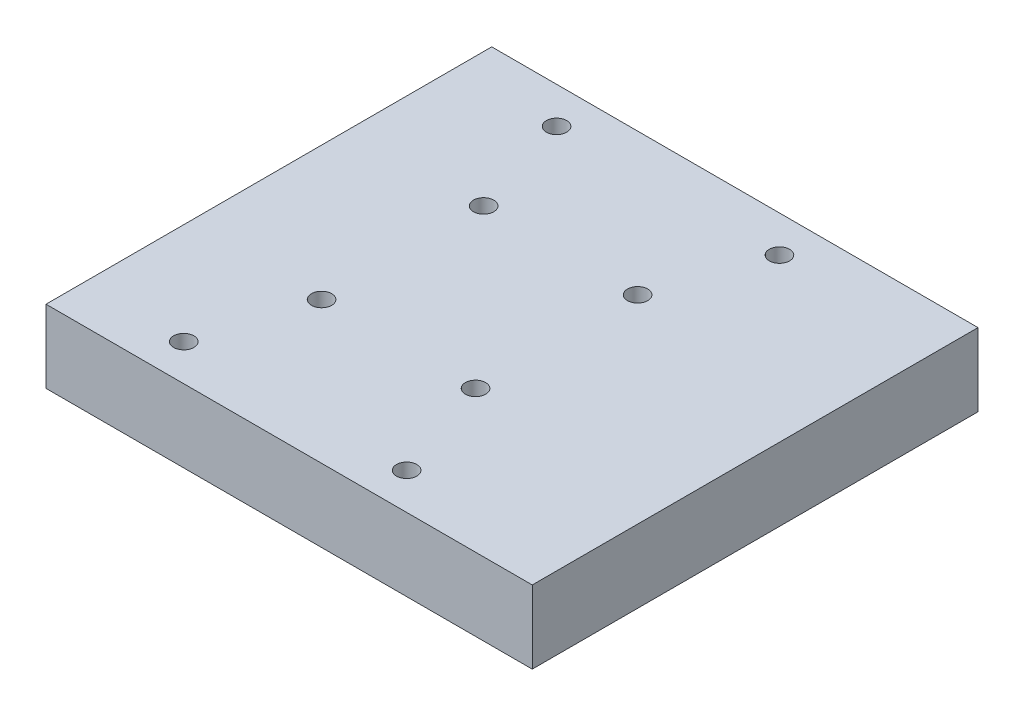
ISO-10303-21;
HEADER;
FILE_DESCRIPTION(('STEP AP214'),'2;1');
FILE_NAME('part.step','',(''),(''),'','','');
FILE_SCHEMA(('AUTOMOTIVE_DESIGN { 1 0 10303 214 1 1 1 1 }'));
ENDSEC;
DATA;
#1=APPLICATION_CONTEXT('core data for automotive mechanical design processes');
#2=APPLICATION_PROTOCOL_DEFINITION('international standard','automotive_design',2000,#1);
#3=PRODUCT_CONTEXT('',#1,'mechanical');
#4=PRODUCT('Part','Part','',(#3));
#5=PRODUCT_RELATED_PRODUCT_CATEGORY('part','',(#4));
#6=PRODUCT_DEFINITION_FORMATION('','',#4);
#7=PRODUCT_DEFINITION_CONTEXT('part definition',#1,'design');
#8=PRODUCT_DEFINITION('design','',#6,#7);
#9=PRODUCT_DEFINITION_SHAPE('','',#8);
#10=(LENGTH_UNIT() NAMED_UNIT(*) SI_UNIT(.MILLI.,.METRE.));
#11=(NAMED_UNIT(*) PLANE_ANGLE_UNIT() SI_UNIT($,.RADIAN.));
#12=(NAMED_UNIT(*) SI_UNIT($,.STERADIAN.) SOLID_ANGLE_UNIT());
#13=UNCERTAINTY_MEASURE_WITH_UNIT(LENGTH_MEASURE(1.E-05),#10,'distance_accuracy_value','');
#14=(GEOMETRIC_REPRESENTATION_CONTEXT(3) GLOBAL_UNCERTAINTY_ASSIGNED_CONTEXT((#13)) GLOBAL_UNIT_ASSIGNED_CONTEXT((#10,
#11,#12)) REPRESENTATION_CONTEXT('',''));
#15=CARTESIAN_POINT('',(0.,0.,0.));
#16=DIRECTION('',(0.,0.,1.));
#17=DIRECTION('',(1.,0.,0.));
#18=AXIS2_PLACEMENT_3D('',#15,#16,#17);
#19=CARTESIAN_POINT('',(60.,18.,-55.));
#20=DIRECTION('',(-1.,0.,0.));
#21=DIRECTION('',(0.,0.,1.));
#22=AXIS2_PLACEMENT_3D('',#19,#20,#21);
#23=PLANE('',#22);
#24=DIRECTION('',(0.,0.,-1.));
#25=VECTOR('',#24,1.);
#26=CARTESIAN_POINT('',(60.,0.,-55.));
#27=LINE('',#26,#25);
#28=CARTESIAN_POINT('',(60.,0.,55.));
#29=VERTEX_POINT('',#28);
#30=CARTESIAN_POINT('',(60.,0.,-55.));
#31=VERTEX_POINT('',#30);
#32=EDGE_CURVE('E96',#29,#31,#27,.T.);
#33=ORIENTED_EDGE('',*,*,#32,.T.);
#34=DIRECTION('',(0.,-1.,0.));
#35=VECTOR('',#34,1.);
#36=CARTESIAN_POINT('',(60.,18.,-55.));
#37=LINE('',#36,#35);
#38=CARTESIAN_POINT('',(60.,18.,-55.));
#39=VERTEX_POINT('',#38);
#40=EDGE_CURVE('E11',#39,#31,#37,.T.);
#41=ORIENTED_EDGE('',*,*,#40,.F.);
#42=DIRECTION('',(0.,0.,-1.));
#43=VECTOR('',#42,1.);
#44=CARTESIAN_POINT('',(60.,18.,-55.));
#45=LINE('',#44,#43);
#46=CARTESIAN_POINT('',(60.,18.,55.));
#47=VERTEX_POINT('',#46);
#48=EDGE_CURVE('E84',#47,#39,#45,.T.);
#49=ORIENTED_EDGE('',*,*,#48,.F.);
#50=DIRECTION('',(0.,-1.,0.));
#51=VECTOR('',#50,1.);
#52=CARTESIAN_POINT('',(60.,18.,55.));
#53=LINE('',#52,#51);
#54=EDGE_CURVE('E92',#47,#29,#53,.T.);
#55=ORIENTED_EDGE('',*,*,#54,.T.);
#56=EDGE_LOOP('',(#33,#41,#49,#55));
#57=FACE_BOUND('',#56,.T.);
#58=ADVANCED_FACE('F33',(#57),#23,.F.);
#59=CARTESIAN_POINT('',(-60.,18.,-55.));
#60=DIRECTION('',(0.,0.,1.));
#61=DIRECTION('',(1.,0.,0.));
#62=AXIS2_PLACEMENT_3D('',#59,#60,#61);
#63=PLANE('',#62);
#64=DIRECTION('',(-1.,0.,0.));
#65=VECTOR('',#64,1.);
#66=CARTESIAN_POINT('',(-60.,0.,-55.));
#67=LINE('',#66,#65);
#68=CARTESIAN_POINT('',(-60.,0.,-55.));
#69=VERTEX_POINT('',#68);
#70=EDGE_CURVE('E88',#31,#69,#67,.T.);
#71=ORIENTED_EDGE('',*,*,#70,.T.);
#72=DIRECTION('',(0.,-1.,0.));
#73=VECTOR('',#72,1.);
#74=CARTESIAN_POINT('',(-60.,18.,-55.));
#75=LINE('',#74,#73);
#76=CARTESIAN_POINT('',(-60.,18.,-55.));
#77=VERTEX_POINT('',#76);
#78=EDGE_CURVE('E41',#77,#69,#75,.T.);
#79=ORIENTED_EDGE('',*,*,#78,.F.);
#80=DIRECTION('',(-1.,0.,0.));
#81=VECTOR('',#80,1.);
#82=CARTESIAN_POINT('',(-60.,18.,-55.));
#83=LINE('',#82,#81);
#84=EDGE_CURVE('E79',#39,#77,#83,.T.);
#85=ORIENTED_EDGE('',*,*,#84,.F.);
#86=ORIENTED_EDGE('',*,*,#40,.T.);
#87=EDGE_LOOP('',(#71,#79,#85,#86));
#88=FACE_BOUND('',#87,.T.);
#89=ADVANCED_FACE('F87',(#88),#63,.F.);
#90=CARTESIAN_POINT('',(-60.,18.,-55.));
#91=DIRECTION('',(1.,0.,0.));
#92=DIRECTION('',(0.,0.,-1.));
#93=AXIS2_PLACEMENT_3D('',#90,#91,#92);
#94=PLANE('',#93);
#95=DIRECTION('',(0.,0.,1.));
#96=VECTOR('',#95,1.);
#97=CARTESIAN_POINT('',(-60.,0.,-55.));
#98=LINE('',#97,#96);
#99=CARTESIAN_POINT('',(-60.,0.,55.));
#100=VERTEX_POINT('',#99);
#101=EDGE_CURVE('E66',#69,#100,#98,.T.);
#102=ORIENTED_EDGE('',*,*,#101,.T.);
#103=DIRECTION('',(0.,-1.,0.));
#104=VECTOR('',#103,1.);
#105=CARTESIAN_POINT('',(-60.,18.,55.));
#106=LINE('',#105,#104);
#107=CARTESIAN_POINT('',(-60.,18.,55.));
#108=VERTEX_POINT('',#107);
#109=EDGE_CURVE('E89',#108,#100,#106,.T.);
#110=ORIENTED_EDGE('',*,*,#109,.F.);
#111=DIRECTION('',(0.,0.,1.));
#112=VECTOR('',#111,1.);
#113=CARTESIAN_POINT('',(-60.,18.,-55.));
#114=LINE('',#113,#112);
#115=EDGE_CURVE('E82',#77,#108,#114,.T.);
#116=ORIENTED_EDGE('',*,*,#115,.F.);
#117=ORIENTED_EDGE('',*,*,#78,.T.);
#118=EDGE_LOOP('',(#102,#110,#116,#117));
#119=FACE_BOUND('',#118,.T.);
#120=ADVANCED_FACE('F90',(#119),#94,.F.);
#121=CARTESIAN_POINT('',(-60.,18.,55.));
#122=DIRECTION('',(0.,0.,-1.));
#123=DIRECTION('',(-1.,0.,0.));
#124=AXIS2_PLACEMENT_3D('',#121,#122,#123);
#125=PLANE('',#124);
#126=DIRECTION('',(1.,0.,0.));
#127=VECTOR('',#126,1.);
#128=CARTESIAN_POINT('',(-60.,0.,55.));
#129=LINE('',#128,#127);
#130=EDGE_CURVE('E72',#100,#29,#129,.T.);
#131=ORIENTED_EDGE('',*,*,#130,.T.);
#132=ORIENTED_EDGE('',*,*,#54,.F.);
#133=DIRECTION('',(1.,0.,0.));
#134=VECTOR('',#133,1.);
#135=CARTESIAN_POINT('',(-60.,18.,55.));
#136=LINE('',#135,#134);
#137=EDGE_CURVE('E49',#108,#47,#136,.T.);
#138=ORIENTED_EDGE('',*,*,#137,.F.);
#139=ORIENTED_EDGE('',*,*,#109,.T.);
#140=EDGE_LOOP('',(#131,#132,#138,#139));
#141=FACE_BOUND('',#140,.T.);
#142=ADVANCED_FACE('F104',(#141),#125,.F.);
#143=CARTESIAN_POINT('',(0.,18.,0.));
#144=DIRECTION('',(0.,1.,0.));
#145=DIRECTION('',(0.,0.,1.));
#146=AXIS2_PLACEMENT_3D('',#143,#144,#145);
#147=PLANE('',#146);
#148=CARTESIAN_POINT('',(-27.,18.,-20.));
#149=DIRECTION('',(0.,-1.,0.));
#150=DIRECTION('',(0.,0.,-1.));
#151=AXIS2_PLACEMENT_3D('',#148,#149,#150);
#152=CIRCLE('',#151,2.5);
#153=CARTESIAN_POINT('',(-27.,18.,-22.5));
#154=VERTEX_POINT('',#153);
#155=EDGE_CURVE('E151',#154,#154,#152,.T.);
#156=ORIENTED_EDGE('',*,*,#155,.T.);
#157=EDGE_LOOP('',(#156));
#158=FACE_BOUND('',#157,.T.);
#159=CARTESIAN_POINT('',(11.,18.,-20.));
#160=DIRECTION('',(0.,-1.,0.));
#161=DIRECTION('',(0.,0.,-1.));
#162=AXIS2_PLACEMENT_3D('',#159,#160,#161);
#163=CIRCLE('',#162,2.5);
#164=CARTESIAN_POINT('',(11.,18.,-22.5));
#165=VERTEX_POINT('',#164);
#166=EDGE_CURVE('E145',#165,#165,#163,.T.);
#167=ORIENTED_EDGE('',*,*,#166,.T.);
#168=EDGE_LOOP('',(#167));
#169=FACE_BOUND('',#168,.T.);
#170=CARTESIAN_POINT('',(11.,18.,20.));
#171=DIRECTION('',(0.,-1.,0.));
#172=DIRECTION('',(0.,0.,-1.));
#173=AXIS2_PLACEMENT_3D('',#170,#171,#172);
#174=CIRCLE('',#173,2.5);
#175=CARTESIAN_POINT('',(11.,18.,17.5));
#176=VERTEX_POINT('',#175);
#177=EDGE_CURVE('E139',#176,#176,#174,.T.);
#178=ORIENTED_EDGE('',*,*,#177,.T.);
#179=EDGE_LOOP('',(#178));
#180=FACE_BOUND('',#179,.T.);
#181=CARTESIAN_POINT('',(-27.,18.,20.));
#182=DIRECTION('',(0.,-1.,0.));
#183=DIRECTION('',(0.,0.,-1.));
#184=AXIS2_PLACEMENT_3D('',#181,#182,#183);
#185=CIRCLE('',#184,2.5);
#186=CARTESIAN_POINT('',(-27.,18.,17.5));
#187=VERTEX_POINT('',#186);
#188=EDGE_CURVE('E133',#187,#187,#185,.T.);
#189=ORIENTED_EDGE('',*,*,#188,.T.);
#190=EDGE_LOOP('',(#189));
#191=FACE_BOUND('',#190,.T.);
#192=CARTESIAN_POINT('',(20.,18.,-46.));
#193=DIRECTION('',(0.,-1.,0.));
#194=DIRECTION('',(0.,0.,-1.));
#195=AXIS2_PLACEMENT_3D('',#192,#193,#194);
#196=CIRCLE('',#195,2.5);
#197=CARTESIAN_POINT('',(20.,18.,-48.5));
#198=VERTEX_POINT('',#197);
#199=EDGE_CURVE('E127',#198,#198,#196,.T.);
#200=ORIENTED_EDGE('',*,*,#199,.T.);
#201=EDGE_LOOP('',(#200));
#202=FACE_BOUND('',#201,.T.);
#203=CARTESIAN_POINT('',(-35.,18.,-46.));
#204=DIRECTION('',(0.,-1.,0.));
#205=DIRECTION('',(0.,0.,-1.));
#206=AXIS2_PLACEMENT_3D('',#203,#204,#205);
#207=CIRCLE('',#206,2.5);
#208=CARTESIAN_POINT('',(-35.,18.,-48.5));
#209=VERTEX_POINT('',#208);
#210=EDGE_CURVE('E121',#209,#209,#207,.T.);
#211=ORIENTED_EDGE('',*,*,#210,.T.);
#212=EDGE_LOOP('',(#211));
#213=FACE_BOUND('',#212,.T.);
#214=CARTESIAN_POINT('',(-35.,18.,46.));
#215=DIRECTION('',(0.,-1.,0.));
#216=DIRECTION('',(0.,0.,-1.));
#217=AXIS2_PLACEMENT_3D('',#214,#215,#216);
#218=CIRCLE('',#217,2.5);
#219=CARTESIAN_POINT('',(-35.,18.,43.5));
#220=VERTEX_POINT('',#219);
#221=EDGE_CURVE('E115',#220,#220,#218,.T.);
#222=ORIENTED_EDGE('',*,*,#221,.T.);
#223=EDGE_LOOP('',(#222));
#224=FACE_BOUND('',#223,.T.);
#225=CARTESIAN_POINT('',(20.,18.,46.));
#226=DIRECTION('',(0.,-1.,0.));
#227=DIRECTION('',(0.,0.,-1.));
#228=AXIS2_PLACEMENT_3D('',#225,#226,#227);
#229=CIRCLE('',#228,2.5);
#230=CARTESIAN_POINT('',(20.,18.,43.5));
#231=VERTEX_POINT('',#230);
#232=EDGE_CURVE('E99',#231,#231,#229,.T.);
#233=ORIENTED_EDGE('',*,*,#232,.T.);
#234=EDGE_LOOP('',(#233));
#235=FACE_BOUND('',#234,.T.);
#236=ORIENTED_EDGE('',*,*,#48,.T.);
#237=ORIENTED_EDGE('',*,*,#84,.T.);
#238=ORIENTED_EDGE('',*,*,#115,.T.);
#239=ORIENTED_EDGE('',*,*,#137,.T.);
#240=EDGE_LOOP('',(#236,#237,#238,#239));
#241=FACE_BOUND('',#240,.T.);
#242=ADVANCED_FACE('F80',(#158,#169,#180,#191,#202,#213,#224,#235,#241),#147,.T.);
#243=CARTESIAN_POINT('',(0.,0.,0.));
#244=DIRECTION('',(0.,1.,0.));
#245=DIRECTION('',(0.,0.,1.));
#246=AXIS2_PLACEMENT_3D('',#243,#244,#245);
#247=PLANE('',#246);
#248=CARTESIAN_POINT('',(-27.,0.,-20.));
#249=DIRECTION('',(0.,-1.,0.));
#250=DIRECTION('',(0.,0.,-1.));
#251=AXIS2_PLACEMENT_3D('',#248,#249,#250);
#252=CIRCLE('',#251,2.49999999999999);
#253=CARTESIAN_POINT('',(-27.,0.,-22.5));
#254=VERTEX_POINT('',#253);
#255=EDGE_CURVE('E154',#254,#254,#252,.T.);
#256=ORIENTED_EDGE('',*,*,#255,.F.);
#257=EDGE_LOOP('',(#256));
#258=FACE_BOUND('',#257,.T.);
#259=CARTESIAN_POINT('',(11.,0.,-20.));
#260=DIRECTION('',(0.,-1.,0.));
#261=DIRECTION('',(0.,0.,-1.));
#262=AXIS2_PLACEMENT_3D('',#259,#260,#261);
#263=CIRCLE('',#262,2.49999999999999);
#264=CARTESIAN_POINT('',(11.,0.,-22.5));
#265=VERTEX_POINT('',#264);
#266=EDGE_CURVE('E148',#265,#265,#263,.T.);
#267=ORIENTED_EDGE('',*,*,#266,.F.);
#268=EDGE_LOOP('',(#267));
#269=FACE_BOUND('',#268,.T.);
#270=CARTESIAN_POINT('',(11.,0.,20.));
#271=DIRECTION('',(0.,-1.,0.));
#272=DIRECTION('',(0.,0.,-1.));
#273=AXIS2_PLACEMENT_3D('',#270,#271,#272);
#274=CIRCLE('',#273,2.49999999999999);
#275=CARTESIAN_POINT('',(11.,0.,17.5));
#276=VERTEX_POINT('',#275);
#277=EDGE_CURVE('E142',#276,#276,#274,.T.);
#278=ORIENTED_EDGE('',*,*,#277,.F.);
#279=EDGE_LOOP('',(#278));
#280=FACE_BOUND('',#279,.T.);
#281=CARTESIAN_POINT('',(-27.,0.,20.));
#282=DIRECTION('',(0.,-1.,0.));
#283=DIRECTION('',(0.,0.,-1.));
#284=AXIS2_PLACEMENT_3D('',#281,#282,#283);
#285=CIRCLE('',#284,2.49999999999999);
#286=CARTESIAN_POINT('',(-27.,0.,17.5));
#287=VERTEX_POINT('',#286);
#288=EDGE_CURVE('E136',#287,#287,#285,.T.);
#289=ORIENTED_EDGE('',*,*,#288,.F.);
#290=EDGE_LOOP('',(#289));
#291=FACE_BOUND('',#290,.T.);
#292=CARTESIAN_POINT('',(20.,0.,-46.));
#293=DIRECTION('',(0.,-1.,0.));
#294=DIRECTION('',(0.,0.,-1.));
#295=AXIS2_PLACEMENT_3D('',#292,#293,#294);
#296=CIRCLE('',#295,2.49999999999999);
#297=CARTESIAN_POINT('',(20.,0.,-48.5));
#298=VERTEX_POINT('',#297);
#299=EDGE_CURVE('E130',#298,#298,#296,.T.);
#300=ORIENTED_EDGE('',*,*,#299,.F.);
#301=EDGE_LOOP('',(#300));
#302=FACE_BOUND('',#301,.T.);
#303=CARTESIAN_POINT('',(-35.,0.,-46.));
#304=DIRECTION('',(0.,-1.,0.));
#305=DIRECTION('',(0.,0.,-1.));
#306=AXIS2_PLACEMENT_3D('',#303,#304,#305);
#307=CIRCLE('',#306,2.49999999999999);
#308=CARTESIAN_POINT('',(-35.,0.,-48.5));
#309=VERTEX_POINT('',#308);
#310=EDGE_CURVE('E124',#309,#309,#307,.T.);
#311=ORIENTED_EDGE('',*,*,#310,.F.);
#312=EDGE_LOOP('',(#311));
#313=FACE_BOUND('',#312,.T.);
#314=CARTESIAN_POINT('',(-35.,0.,46.));
#315=DIRECTION('',(0.,-1.,0.));
#316=DIRECTION('',(0.,0.,-1.));
#317=AXIS2_PLACEMENT_3D('',#314,#315,#316);
#318=CIRCLE('',#317,2.49999999999999);
#319=CARTESIAN_POINT('',(-35.,0.,43.5));
#320=VERTEX_POINT('',#319);
#321=EDGE_CURVE('E118',#320,#320,#318,.T.);
#322=ORIENTED_EDGE('',*,*,#321,.F.);
#323=EDGE_LOOP('',(#322));
#324=FACE_BOUND('',#323,.T.);
#325=CARTESIAN_POINT('',(20.,0.,46.));
#326=DIRECTION('',(0.,-1.,0.));
#327=DIRECTION('',(0.,0.,-1.));
#328=AXIS2_PLACEMENT_3D('',#325,#326,#327);
#329=CIRCLE('',#328,2.49999999999999);
#330=CARTESIAN_POINT('',(20.,0.,43.5));
#331=VERTEX_POINT('',#330);
#332=EDGE_CURVE('E112',#331,#331,#329,.T.);
#333=ORIENTED_EDGE('',*,*,#332,.F.);
#334=EDGE_LOOP('',(#333));
#335=FACE_BOUND('',#334,.T.);
#336=ORIENTED_EDGE('',*,*,#32,.F.);
#337=ORIENTED_EDGE('',*,*,#130,.F.);
#338=ORIENTED_EDGE('',*,*,#101,.F.);
#339=ORIENTED_EDGE('',*,*,#70,.F.);
#340=EDGE_LOOP('',(#336,#337,#338,#339));
#341=FACE_BOUND('',#340,.T.);
#342=ADVANCED_FACE('F107',(#258,#269,#280,#291,#302,#313,#324,#335,#341),#247,.F.);
#343=CARTESIAN_POINT('',(20.,0.,46.));
#344=DIRECTION('',(0.,-1.,0.));
#345=DIRECTION('',(0.,0.,-1.));
#346=AXIS2_PLACEMENT_3D('',#343,#344,#345);
#347=CYLINDRICAL_SURFACE('',#346,2.49999999999999);
#348=ORIENTED_EDGE('',*,*,#232,.F.);
#349=EDGE_LOOP('',(#348));
#350=FACE_BOUND('',#349,.T.);
#351=ORIENTED_EDGE('',*,*,#332,.T.);
#352=EDGE_LOOP('',(#351));
#353=FACE_BOUND('',#352,.T.);
#354=ADVANCED_FACE('F162',(#350,#353),#347,.F.);
#355=CARTESIAN_POINT('',(-35.,0.,46.));
#356=DIRECTION('',(0.,-1.,0.));
#357=DIRECTION('',(0.,0.,-1.));
#358=AXIS2_PLACEMENT_3D('',#355,#356,#357);
#359=CYLINDRICAL_SURFACE('',#358,2.49999999999999);
#360=ORIENTED_EDGE('',*,*,#221,.F.);
#361=EDGE_LOOP('',(#360));
#362=FACE_BOUND('',#361,.T.);
#363=ORIENTED_EDGE('',*,*,#321,.T.);
#364=EDGE_LOOP('',(#363));
#365=FACE_BOUND('',#364,.T.);
#366=ADVANCED_FACE('F179',(#362,#365),#359,.F.);
#367=CARTESIAN_POINT('',(-35.,0.,-46.));
#368=DIRECTION('',(0.,-1.,0.));
#369=DIRECTION('',(0.,0.,-1.));
#370=AXIS2_PLACEMENT_3D('',#367,#368,#369);
#371=CYLINDRICAL_SURFACE('',#370,2.49999999999999);
#372=ORIENTED_EDGE('',*,*,#210,.F.);
#373=EDGE_LOOP('',(#372));
#374=FACE_BOUND('',#373,.T.);
#375=ORIENTED_EDGE('',*,*,#310,.T.);
#376=EDGE_LOOP('',(#375));
#377=FACE_BOUND('',#376,.T.);
#378=ADVANCED_FACE('F186',(#374,#377),#371,.F.);
#379=CARTESIAN_POINT('',(20.,0.,-46.));
#380=DIRECTION('',(0.,-1.,0.));
#381=DIRECTION('',(0.,0.,-1.));
#382=AXIS2_PLACEMENT_3D('',#379,#380,#381);
#383=CYLINDRICAL_SURFACE('',#382,2.49999999999999);
#384=ORIENTED_EDGE('',*,*,#199,.F.);
#385=EDGE_LOOP('',(#384));
#386=FACE_BOUND('',#385,.T.);
#387=ORIENTED_EDGE('',*,*,#299,.T.);
#388=EDGE_LOOP('',(#387));
#389=FACE_BOUND('',#388,.T.);
#390=ADVANCED_FACE('F224',(#386,#389),#383,.F.);
#391=CARTESIAN_POINT('',(-27.,0.,20.));
#392=DIRECTION('',(0.,-1.,0.));
#393=DIRECTION('',(0.,0.,-1.));
#394=AXIS2_PLACEMENT_3D('',#391,#392,#393);
#395=CYLINDRICAL_SURFACE('',#394,2.49999999999999);
#396=ORIENTED_EDGE('',*,*,#188,.F.);
#397=EDGE_LOOP('',(#396));
#398=FACE_BOUND('',#397,.T.);
#399=ORIENTED_EDGE('',*,*,#288,.T.);
#400=EDGE_LOOP('',(#399));
#401=FACE_BOUND('',#400,.T.);
#402=ADVANCED_FACE('F229',(#398,#401),#395,.F.);
#403=CARTESIAN_POINT('',(11.,0.,20.));
#404=DIRECTION('',(0.,-1.,0.));
#405=DIRECTION('',(0.,0.,-1.));
#406=AXIS2_PLACEMENT_3D('',#403,#404,#405);
#407=CYLINDRICAL_SURFACE('',#406,2.49999999999999);
#408=ORIENTED_EDGE('',*,*,#177,.F.);
#409=EDGE_LOOP('',(#408));
#410=FACE_BOUND('',#409,.T.);
#411=ORIENTED_EDGE('',*,*,#277,.T.);
#412=EDGE_LOOP('',(#411));
#413=FACE_BOUND('',#412,.T.);
#414=ADVANCED_FACE('F235',(#410,#413),#407,.F.);
#415=CARTESIAN_POINT('',(11.,0.,-20.));
#416=DIRECTION('',(0.,-1.,0.));
#417=DIRECTION('',(0.,0.,-1.));
#418=AXIS2_PLACEMENT_3D('',#415,#416,#417);
#419=CYLINDRICAL_SURFACE('',#418,2.49999999999999);
#420=ORIENTED_EDGE('',*,*,#166,.F.);
#421=EDGE_LOOP('',(#420));
#422=FACE_BOUND('',#421,.T.);
#423=ORIENTED_EDGE('',*,*,#266,.T.);
#424=EDGE_LOOP('',(#423));
#425=FACE_BOUND('',#424,.T.);
#426=ADVANCED_FACE('F239',(#422,#425),#419,.F.);
#427=CARTESIAN_POINT('',(-27.,0.,-20.));
#428=DIRECTION('',(0.,-1.,0.));
#429=DIRECTION('',(0.,0.,-1.));
#430=AXIS2_PLACEMENT_3D('',#427,#428,#429);
#431=CYLINDRICAL_SURFACE('',#430,2.49999999999999);
#432=ORIENTED_EDGE('',*,*,#155,.F.);
#433=EDGE_LOOP('',(#432));
#434=FACE_BOUND('',#433,.T.);
#435=ORIENTED_EDGE('',*,*,#255,.T.);
#436=EDGE_LOOP('',(#435));
#437=FACE_BOUND('',#436,.T.);
#438=ADVANCED_FACE('F158',(#434,#437),#431,.F.);
#439=CLOSED_SHELL('',(#58,#89,#120,#142,#242,#342,#354,#366,#378,#390,#402,#414,#426,#438));
#440=MANIFOLD_SOLID_BREP('B2',#439);
#441=ADVANCED_BREP_SHAPE_REPRESENTATION('',(#18,#440),#14);
#442=SHAPE_DEFINITION_REPRESENTATION(#9,#441);
ENDSEC;
END-ISO-10303-21;
